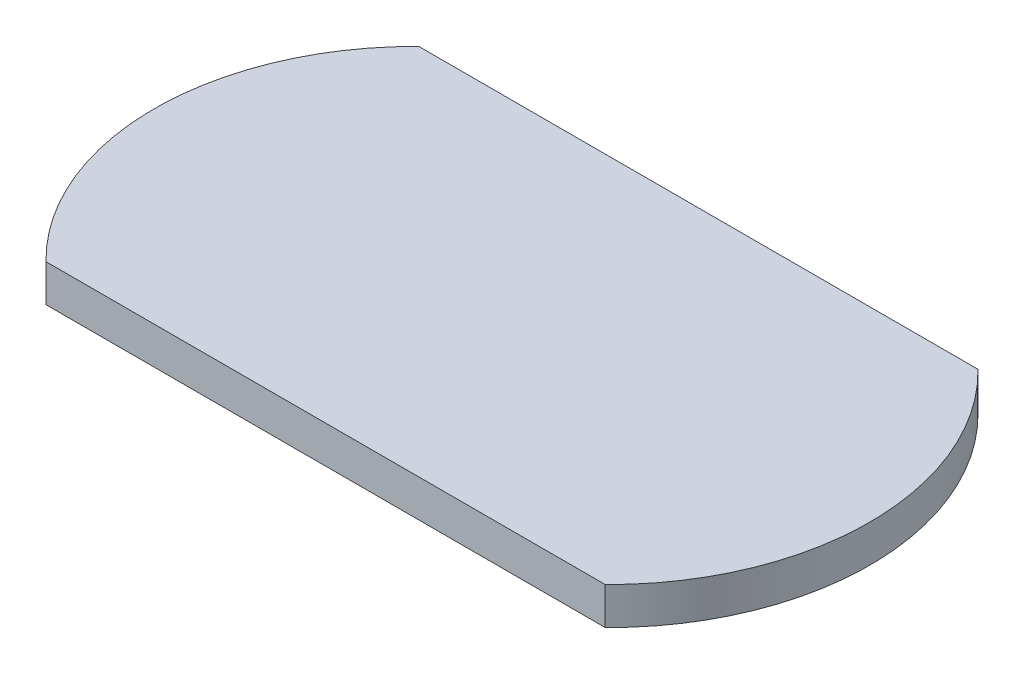
ISO-10303-21;
HEADER;
FILE_DESCRIPTION(('STEP AP214'),'2;1');
FILE_NAME('part.step','',(''),(''),'','','');
FILE_SCHEMA(('AUTOMOTIVE_DESIGN { 1 0 10303 214 1 1 1 1 }'));
ENDSEC;
DATA;
#1=APPLICATION_CONTEXT('core data for automotive mechanical design processes');
#2=APPLICATION_PROTOCOL_DEFINITION('international standard','automotive_design',2000,#1);
#3=PRODUCT_CONTEXT('',#1,'mechanical');
#4=PRODUCT('Part','Part','',(#3));
#5=PRODUCT_RELATED_PRODUCT_CATEGORY('part','',(#4));
#6=PRODUCT_DEFINITION_FORMATION('','',#4);
#7=PRODUCT_DEFINITION_CONTEXT('part definition',#1,'design');
#8=PRODUCT_DEFINITION('design','',#6,#7);
#9=PRODUCT_DEFINITION_SHAPE('','',#8);
#10=(LENGTH_UNIT() NAMED_UNIT(*) SI_UNIT(.MILLI.,.METRE.));
#11=(NAMED_UNIT(*) PLANE_ANGLE_UNIT() SI_UNIT($,.RADIAN.));
#12=(NAMED_UNIT(*) SI_UNIT($,.STERADIAN.) SOLID_ANGLE_UNIT());
#13=UNCERTAINTY_MEASURE_WITH_UNIT(LENGTH_MEASURE(1.E-05),#10,'distance_accuracy_value','');
#14=(GEOMETRIC_REPRESENTATION_CONTEXT(3) GLOBAL_UNCERTAINTY_ASSIGNED_CONTEXT((#13)) GLOBAL_UNIT_ASSIGNED_CONTEXT((#10,
#11,#12)) REPRESENTATION_CONTEXT('',''));
#15=CARTESIAN_POINT('',(0.,0.,0.));
#16=DIRECTION('',(0.,0.,1.));
#17=DIRECTION('',(1.,0.,0.));
#18=AXIS2_PLACEMENT_3D('',#15,#16,#17);
#19=CARTESIAN_POINT('',(-5.38195280267796,1.,-0.550613065678368));
#20=DIRECTION('',(0.,-1.,0.));
#21=DIRECTION('',(0.,0.,-1.));
#22=AXIS2_PLACEMENT_3D('',#19,#20,#21);
#23=CYLINDRICAL_SURFACE('',#22,7.);
#24=CARTESIAN_POINT('',(-5.38195280267796,0.,-0.550613065678368));
#25=DIRECTION('',(0.,1.,0.));
#26=DIRECTION('',(0.,0.,1.));
#27=AXIS2_PLACEMENT_3D('',#24,#25,#26);
#28=CIRCLE('',#27,7.);
#29=CARTESIAN_POINT('',(-10.2809322882443,0.,-5.55061306567837));
#30=VERTEX_POINT('',#29);
#31=CARTESIAN_POINT('',(-10.2809322882443,0.,4.44938693432163));
#32=VERTEX_POINT('',#31);
#33=EDGE_CURVE('E98',#30,#32,#28,.T.);
#34=ORIENTED_EDGE('',*,*,#33,.T.);
#35=DIRECTION('',(0.,-1.,0.));
#36=VECTOR('',#35,1.);
#37=CARTESIAN_POINT('',(-10.2809322882443,1.,4.44938693432163));
#38=LINE('',#37,#36);
#39=CARTESIAN_POINT('',(-10.2809322882443,1.,4.44938693432163));
#40=VERTEX_POINT('',#39);
#41=EDGE_CURVE('E11',#40,#32,#38,.T.);
#42=ORIENTED_EDGE('',*,*,#41,.F.);
#43=CARTESIAN_POINT('',(-5.38195280267796,1.,-0.550613065678368));
#44=DIRECTION('',(0.,1.,0.));
#45=DIRECTION('',(0.,0.,1.));
#46=AXIS2_PLACEMENT_3D('',#43,#44,#45);
#47=CIRCLE('',#46,7.);
#48=CARTESIAN_POINT('',(-10.2809322882443,1.,-5.55061306567837));
#49=VERTEX_POINT('',#48);
#50=EDGE_CURVE('E84',#49,#40,#47,.T.);
#51=ORIENTED_EDGE('',*,*,#50,.F.);
#52=DIRECTION('',(0.,-1.,0.));
#53=VECTOR('',#52,1.);
#54=CARTESIAN_POINT('',(-10.2809322882443,1.,-5.55061306567837));
#55=LINE('',#54,#53);
#56=EDGE_CURVE('E51',#49,#30,#55,.T.);
#57=ORIENTED_EDGE('',*,*,#56,.T.);
#58=EDGE_LOOP('',(#34,#42,#51,#57));
#59=FACE_BOUND('',#58,.T.);
#60=ADVANCED_FACE('F35',(#59),#23,.T.);
#61=CARTESIAN_POINT('',(0.,1.,4.44938693432163));
#62=DIRECTION('',(0.,0.,-1.));
#63=DIRECTION('',(-1.,0.,0.));
#64=AXIS2_PLACEMENT_3D('',#61,#62,#63);
#65=PLANE('',#64);
#66=DIRECTION('',(1.,0.,0.));
#67=VECTOR('',#66,1.);
#68=CARTESIAN_POINT('',(0.,0.,4.44938693432163));
#69=LINE('',#68,#67);
#70=CARTESIAN_POINT('',(4.71906771175568,0.,4.44938693432163));
#71=VERTEX_POINT('',#70);
#72=EDGE_CURVE('E89',#32,#71,#69,.T.);
#73=ORIENTED_EDGE('',*,*,#72,.T.);
#74=DIRECTION('',(0.,-1.,0.));
#75=VECTOR('',#74,1.);
#76=CARTESIAN_POINT('',(4.71906771175568,1.,4.44938693432163));
#77=LINE('',#76,#75);
#78=CARTESIAN_POINT('',(4.71906771175568,1.,4.44938693432163));
#79=VERTEX_POINT('',#78);
#80=EDGE_CURVE('E43',#79,#71,#77,.T.);
#81=ORIENTED_EDGE('',*,*,#80,.F.);
#82=DIRECTION('',(1.,0.,0.));
#83=VECTOR('',#82,1.);
#84=CARTESIAN_POINT('',(0.,1.,4.44938693432163));
#85=LINE('',#84,#83);
#86=EDGE_CURVE('E76',#40,#79,#85,.T.);
#87=ORIENTED_EDGE('',*,*,#86,.F.);
#88=ORIENTED_EDGE('',*,*,#41,.T.);
#89=EDGE_LOOP('',(#73,#81,#87,#88));
#90=FACE_BOUND('',#89,.T.);
#91=ADVANCED_FACE('F88',(#90),#65,.F.);
#92=CARTESIAN_POINT('',(-0.179911773810672,1.,-0.550613065678368));
#93=DIRECTION('',(0.,-1.,0.));
#94=DIRECTION('',(0.,0.,-1.));
#95=AXIS2_PLACEMENT_3D('',#92,#93,#94);
#96=CYLINDRICAL_SURFACE('',#95,7.);
#97=CARTESIAN_POINT('',(-0.179911773810672,0.,-0.550613065678368));
#98=DIRECTION('',(0.,1.,0.));
#99=DIRECTION('',(0.,0.,1.));
#100=AXIS2_PLACEMENT_3D('',#97,#98,#99);
#101=CIRCLE('',#100,7.);
#102=CARTESIAN_POINT('',(4.71906771175568,0.,-5.55061306567837));
#103=VERTEX_POINT('',#102);
#104=EDGE_CURVE('E101',#103,#71,#101,.F.);
#105=ORIENTED_EDGE('',*,*,#104,.F.);
#106=DIRECTION('',(0.,-1.,0.));
#107=VECTOR('',#106,1.);
#108=CARTESIAN_POINT('',(4.71906771175568,1.,-5.55061306567837));
#109=LINE('',#108,#107);
#110=CARTESIAN_POINT('',(4.71906771175568,1.,-5.55061306567837));
#111=VERTEX_POINT('',#110);
#112=EDGE_CURVE('E65',#111,#103,#109,.T.);
#113=ORIENTED_EDGE('',*,*,#112,.F.);
#114=CARTESIAN_POINT('',(-0.179911773810672,1.,-0.550613065678368));
#115=DIRECTION('',(0.,1.,0.));
#116=DIRECTION('',(0.,0.,1.));
#117=AXIS2_PLACEMENT_3D('',#114,#115,#116);
#118=CIRCLE('',#117,7.);
#119=EDGE_CURVE('E83',#111,#79,#118,.F.);
#120=ORIENTED_EDGE('',*,*,#119,.T.);
#121=ORIENTED_EDGE('',*,*,#80,.T.);
#122=EDGE_LOOP('',(#105,#113,#120,#121));
#123=FACE_BOUND('',#122,.T.);
#124=ADVANCED_FACE('F92',(#123),#96,.T.);
#125=CARTESIAN_POINT('',(0.,1.,-5.55061306567837));
#126=DIRECTION('',(0.,0.,-1.));
#127=DIRECTION('',(-1.,0.,0.));
#128=AXIS2_PLACEMENT_3D('',#125,#126,#127);
#129=PLANE('',#128);
#130=DIRECTION('',(1.,0.,0.));
#131=VECTOR('',#130,1.);
#132=CARTESIAN_POINT('',(0.,0.,-5.55061306567837));
#133=LINE('',#132,#131);
#134=EDGE_CURVE('E103',#30,#103,#133,.T.);
#135=ORIENTED_EDGE('',*,*,#134,.F.);
#136=ORIENTED_EDGE('',*,*,#56,.F.);
#137=DIRECTION('',(1.,0.,0.));
#138=VECTOR('',#137,1.);
#139=CARTESIAN_POINT('',(0.,1.,-5.55061306567837));
#140=LINE('',#139,#138);
#141=EDGE_CURVE('E93',#49,#111,#140,.T.);
#142=ORIENTED_EDGE('',*,*,#141,.T.);
#143=ORIENTED_EDGE('',*,*,#112,.T.);
#144=EDGE_LOOP('',(#135,#136,#142,#143));
#145=FACE_BOUND('',#144,.T.);
#146=ADVANCED_FACE('F109',(#145),#129,.T.);
#147=CARTESIAN_POINT('',(0.,1.,0.));
#148=DIRECTION('',(0.,1.,0.));
#149=DIRECTION('',(0.,0.,1.));
#150=AXIS2_PLACEMENT_3D('',#147,#148,#149);
#151=PLANE('',#150);
#152=ORIENTED_EDGE('',*,*,#50,.T.);
#153=ORIENTED_EDGE('',*,*,#86,.T.);
#154=ORIENTED_EDGE('',*,*,#119,.F.);
#155=ORIENTED_EDGE('',*,*,#141,.F.);
#156=EDGE_LOOP('',(#152,#153,#154,#155));
#157=FACE_BOUND('',#156,.T.);
#158=ADVANCED_FACE('F80',(#157),#151,.T.);
#159=CARTESIAN_POINT('',(0.,0.,0.));
#160=DIRECTION('',(0.,1.,0.));
#161=DIRECTION('',(0.,0.,1.));
#162=AXIS2_PLACEMENT_3D('',#159,#160,#161);
#163=PLANE('',#162);
#164=ORIENTED_EDGE('',*,*,#33,.F.);
#165=ORIENTED_EDGE('',*,*,#134,.T.);
#166=ORIENTED_EDGE('',*,*,#104,.T.);
#167=ORIENTED_EDGE('',*,*,#72,.F.);
#168=EDGE_LOOP('',(#164,#165,#166,#167));
#169=FACE_BOUND('',#168,.T.);
#170=ADVANCED_FACE('F108',(#169),#163,.F.);
#171=CLOSED_SHELL('',(#60,#91,#124,#146,#158,#170));
#172=MANIFOLD_SOLID_BREP('B2',#171);
#173=ADVANCED_BREP_SHAPE_REPRESENTATION('',(#18,#172),#14);
#174=SHAPE_DEFINITION_REPRESENTATION(#9,#173);
ENDSEC;
END-ISO-10303-21;
